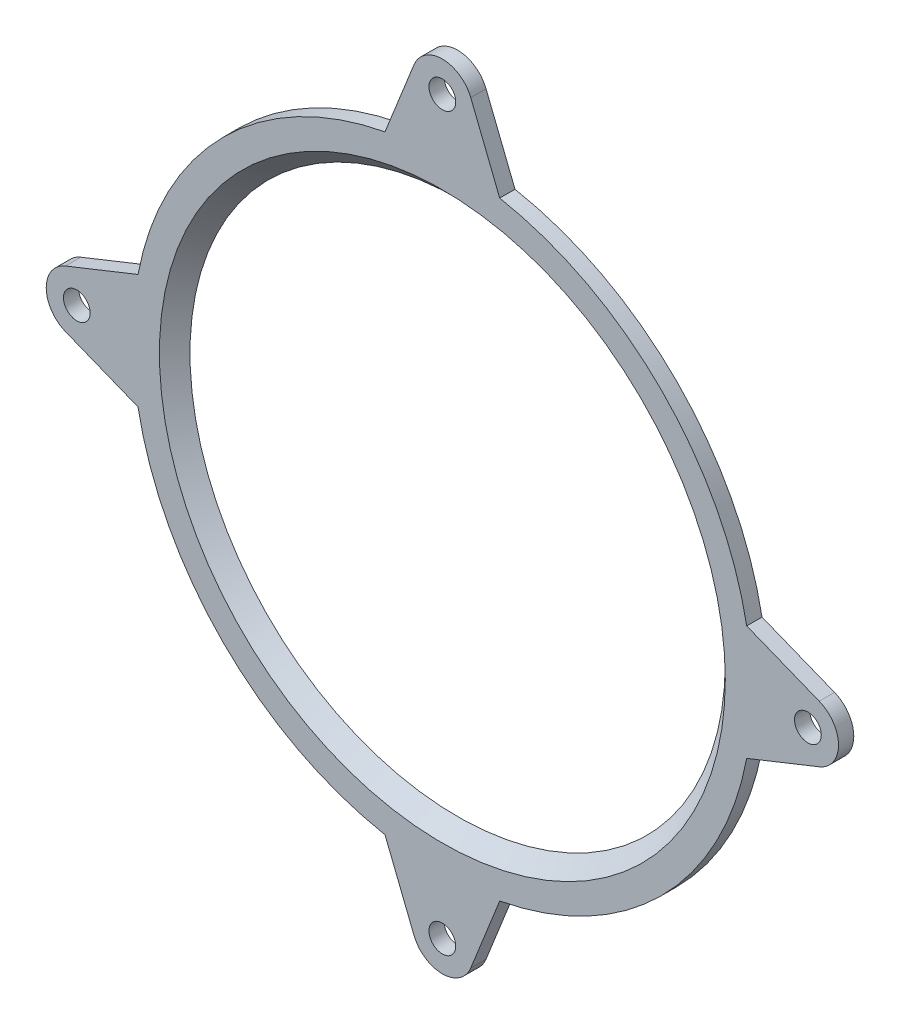
ISO-10303-21;
HEADER;
FILE_DESCRIPTION(('STEP AP214'),'2;1');
FILE_NAME('part.step','',(''),(''),'','','');
FILE_SCHEMA(('AUTOMOTIVE_DESIGN { 1 0 10303 214 1 1 1 1 }'));
ENDSEC;
DATA;
#1=APPLICATION_CONTEXT('core data for automotive mechanical design processes');
#2=APPLICATION_PROTOCOL_DEFINITION('international standard','automotive_design',2000,#1);
#3=PRODUCT_CONTEXT('',#1,'mechanical');
#4=PRODUCT('Part','Part','',(#3));
#5=PRODUCT_RELATED_PRODUCT_CATEGORY('part','',(#4));
#6=PRODUCT_DEFINITION_FORMATION('','',#4);
#7=PRODUCT_DEFINITION_CONTEXT('part definition',#1,'design');
#8=PRODUCT_DEFINITION('design','',#6,#7);
#9=PRODUCT_DEFINITION_SHAPE('','',#8);
#10=(LENGTH_UNIT() NAMED_UNIT(*) SI_UNIT(.MILLI.,.METRE.));
#11=(NAMED_UNIT(*) PLANE_ANGLE_UNIT() SI_UNIT($,.RADIAN.));
#12=(NAMED_UNIT(*) SI_UNIT($,.STERADIAN.) SOLID_ANGLE_UNIT());
#13=UNCERTAINTY_MEASURE_WITH_UNIT(LENGTH_MEASURE(1.E-05),#10,'distance_accuracy_value','');
#14=(GEOMETRIC_REPRESENTATION_CONTEXT(3) GLOBAL_UNCERTAINTY_ASSIGNED_CONTEXT((#13)) GLOBAL_UNIT_ASSIGNED_CONTEXT((#10,
#11,#12)) REPRESENTATION_CONTEXT('',''));
#15=CARTESIAN_POINT('',(0.,0.,0.));
#16=DIRECTION('',(0.,0.,1.));
#17=DIRECTION('',(1.,0.,0.));
#18=AXIS2_PLACEMENT_3D('',#15,#16,#17);
#19=CARTESIAN_POINT('',(0.,0.,2.));
#20=DIRECTION('',(0.,0.,-1.));
#21=DIRECTION('',(-1.,0.,0.));
#22=AXIS2_PLACEMENT_3D('',#19,#20,#21);
#23=CYLINDRICAL_SURFACE('',#22,40.5);
#24=DIRECTION('',(0.,0.,-1.));
#25=VECTOR('',#24,1.);
#26=CARTESIAN_POINT('',(39.7994974842649,-7.49999999999958,2.));
#27=LINE('',#26,#25);
#28=CARTESIAN_POINT('',(39.7994974842649,-7.49999999999959,2.));
#29=VERTEX_POINT('',#28);
#30=CARTESIAN_POINT('',(39.7994974842649,-7.49999999999959,0.));
#31=VERTEX_POINT('',#30);
#32=EDGE_CURVE('E63',#29,#31,#27,.T.);
#33=ORIENTED_EDGE('',*,*,#32,.F.);
#34=CARTESIAN_POINT('',(0.,0.,2.));
#35=DIRECTION('',(0.,0.,1.));
#36=DIRECTION('',(1.,0.,0.));
#37=AXIS2_PLACEMENT_3D('',#34,#35,#36);
#38=CIRCLE('',#37,40.5);
#39=CARTESIAN_POINT('',(7.50000000000001,-39.7994974842648,2.));
#40=VERTEX_POINT('',#39);
#41=EDGE_CURVE('E162',#40,#29,#38,.T.);
#42=ORIENTED_EDGE('',*,*,#41,.F.);
#43=DIRECTION('',(0.,0.,-1.));
#44=VECTOR('',#43,1.);
#45=CARTESIAN_POINT('',(7.5,-39.7994974842648,2.));
#46=LINE('',#45,#44);
#47=CARTESIAN_POINT('',(7.5,-39.7994974842648,0.));
#48=VERTEX_POINT('',#47);
#49=EDGE_CURVE('E207',#40,#48,#46,.T.);
#50=ORIENTED_EDGE('',*,*,#49,.T.);
#51=CARTESIAN_POINT('',(0.,0.,0.));
#52=DIRECTION('',(0.,0.,1.));
#53=DIRECTION('',(1.,0.,0.));
#54=AXIS2_PLACEMENT_3D('',#51,#52,#53);
#55=CIRCLE('',#54,40.5);
#56=EDGE_CURVE('E297',#48,#31,#55,.T.);
#57=ORIENTED_EDGE('',*,*,#56,.T.);
#58=EDGE_LOOP('',(#33,#42,#50,#57));
#59=FACE_BOUND('',#58,.T.);
#60=ADVANCED_FACE('F39',(#59),#23,.T.);
#61=DIRECTION('',(0.,0.,-1.));
#62=VECTOR('',#61,1.);
#63=CARTESIAN_POINT('',(39.7994974842647,7.50000000000042,2.));
#64=LINE('',#63,#62);
#65=CARTESIAN_POINT('',(39.7994974842647,7.50000000000042,2.));
#66=VERTEX_POINT('',#65);
#67=CARTESIAN_POINT('',(39.7994974842647,7.50000000000042,0.));
#68=VERTEX_POINT('',#67);
#69=EDGE_CURVE('E180',#66,#68,#64,.T.);
#70=ORIENTED_EDGE('',*,*,#69,.T.);
#71=CARTESIAN_POINT('',(7.50000000000001,39.7994974842648,0.));
#72=VERTEX_POINT('',#71);
#73=EDGE_CURVE('E290',#68,#72,#55,.T.);
#74=ORIENTED_EDGE('',*,*,#73,.T.);
#75=DIRECTION('',(0.,0.,-1.));
#76=VECTOR('',#75,1.);
#77=CARTESIAN_POINT('',(7.5,39.7994974842648,2.));
#78=LINE('',#77,#76);
#79=CARTESIAN_POINT('',(7.50000000000001,39.7994974842648,2.));
#80=VERTEX_POINT('',#79);
#81=EDGE_CURVE('E284',#80,#72,#78,.T.);
#82=ORIENTED_EDGE('',*,*,#81,.F.);
#83=EDGE_CURVE('E55',#66,#80,#38,.T.);
#84=ORIENTED_EDGE('',*,*,#83,.F.);
#85=EDGE_LOOP('',(#70,#74,#82,#84));
#86=FACE_BOUND('',#85,.T.);
#87=ADVANCED_FACE('F310',(#86),#23,.T.);
#88=DIRECTION('',(0.,0.,-1.));
#89=VECTOR('',#88,1.);
#90=CARTESIAN_POINT('',(-7.5,-39.7994974842648,2.));
#91=LINE('',#90,#89);
#92=CARTESIAN_POINT('',(-7.50000000000001,-39.7994974842648,2.));
#93=VERTEX_POINT('',#92);
#94=CARTESIAN_POINT('',(-7.50000000000001,-39.7994974842648,0.));
#95=VERTEX_POINT('',#94);
#96=EDGE_CURVE('E221',#93,#95,#91,.T.);
#97=ORIENTED_EDGE('',*,*,#96,.F.);
#98=CARTESIAN_POINT('',(-39.7994974842648,-7.50000000000013,2.));
#99=VERTEX_POINT('',#98);
#100=EDGE_CURVE('E291',#99,#93,#38,.T.);
#101=ORIENTED_EDGE('',*,*,#100,.F.);
#102=DIRECTION('',(0.,0.,-1.));
#103=VECTOR('',#102,1.);
#104=CARTESIAN_POINT('',(-39.7994974842648,-7.50000000000014,2.));
#105=LINE('',#104,#103);
#106=CARTESIAN_POINT('',(-39.7994974842648,-7.50000000000014,0.));
#107=VERTEX_POINT('',#106);
#108=EDGE_CURVE('E239',#99,#107,#105,.T.);
#109=ORIENTED_EDGE('',*,*,#108,.T.);
#110=EDGE_CURVE('E293',#107,#95,#55,.T.);
#111=ORIENTED_EDGE('',*,*,#110,.T.);
#112=EDGE_LOOP('',(#97,#101,#109,#111));
#113=FACE_BOUND('',#112,.T.);
#114=ADVANCED_FACE('F340',(#113),#23,.T.);
#115=DIRECTION('',(0.,0.,-1.));
#116=VECTOR('',#115,1.);
#117=CARTESIAN_POINT('',(-39.7994974842648,7.49999999999986,2.));
#118=LINE('',#117,#116);
#119=CARTESIAN_POINT('',(-39.7994974842648,7.49999999999986,2.));
#120=VERTEX_POINT('',#119);
#121=CARTESIAN_POINT('',(-39.7994974842648,7.49999999999986,0.));
#122=VERTEX_POINT('',#121);
#123=EDGE_CURVE('E253',#120,#122,#118,.T.);
#124=ORIENTED_EDGE('',*,*,#123,.F.);
#125=CARTESIAN_POINT('',(-7.5,39.7994974842648,2.));
#126=VERTEX_POINT('',#125);
#127=EDGE_CURVE('E48',#126,#120,#38,.T.);
#128=ORIENTED_EDGE('',*,*,#127,.F.);
#129=DIRECTION('',(0.,0.,-1.));
#130=VECTOR('',#129,1.);
#131=CARTESIAN_POINT('',(-7.5,39.7994974842648,2.));
#132=LINE('',#131,#130);
#133=CARTESIAN_POINT('',(-7.50000000000001,39.7994974842648,0.));
#134=VERTEX_POINT('',#133);
#135=EDGE_CURVE('E271',#126,#134,#132,.T.);
#136=ORIENTED_EDGE('',*,*,#135,.T.);
#137=EDGE_CURVE('E292',#134,#122,#55,.T.);
#138=ORIENTED_EDGE('',*,*,#137,.T.);
#139=EDGE_LOOP('',(#124,#128,#136,#138));
#140=FACE_BOUND('',#139,.T.);
#141=ADVANCED_FACE('F324',(#140),#23,.T.);
#142=CARTESIAN_POINT('',(0.,0.,2.));
#143=DIRECTION('',(0.,0.,1.));
#144=DIRECTION('',(1.,0.,0.));
#145=AXIS2_PLACEMENT_3D('',#142,#143,#144);
#146=PLANE('',#145);
#147=CARTESIAN_POINT('',(0.,0.,2.));
#148=DIRECTION('',(0.,0.,1.));
#149=DIRECTION('',(1.,0.,0.));
#150=AXIS2_PLACEMENT_3D('',#147,#148,#149);
#151=CIRCLE('',#150,37.);
#152=CARTESIAN_POINT('',(37.,0.,2.));
#153=VERTEX_POINT('',#152);
#154=EDGE_CURVE('E11',#153,#153,#151,.F.);
#155=ORIENTED_EDGE('',*,*,#154,.T.);
#156=EDGE_LOOP('',(#155));
#157=FACE_BOUND('',#156,.T.);
#158=ORIENTED_EDGE('',*,*,#127,.T.);
#159=DIRECTION('',(-0.928751030575038,-0.370704091164104,0.));
#160=VECTOR('',#159,1.);
#161=CARTESIAN_POINT('',(-39.7994974842648,7.49999999999986,2.));
#162=LINE('',#161,#160);
#163=CARTESIAN_POINT('',(-49.2823138489212,3.71500412229998,2.));
#164=VERTEX_POINT('',#163);
#165=EDGE_CURVE('E231',#120,#164,#162,.T.);
#166=ORIENTED_EDGE('',*,*,#165,.T.);
#167=CARTESIAN_POINT('',(-47.7994974842648,-1.6689105347239E-13,2.));
#168=DIRECTION('',(0.,0.,1.));
#169=DIRECTION('',(0.,1.,0.));
#170=AXIS2_PLACEMENT_3D('',#167,#168,#169);
#171=CIRCLE('',#170,4.);
#172=CARTESIAN_POINT('',(-49.2823138489212,-3.71500412230033,2.));
#173=VERTEX_POINT('',#172);
#174=EDGE_CURVE('E233',#164,#173,#171,.T.);
#175=ORIENTED_EDGE('',*,*,#174,.T.);
#176=DIRECTION('',(0.928751030575041,-0.370704091164097,0.));
#177=VECTOR('',#176,1.);
#178=CARTESIAN_POINT('',(-39.7994974842648,-7.50000000000014,2.));
#179=LINE('',#178,#177);
#180=EDGE_CURVE('E236',#173,#99,#179,.T.);
#181=ORIENTED_EDGE('',*,*,#180,.T.);
#182=ORIENTED_EDGE('',*,*,#100,.T.);
#183=DIRECTION('',(0.3707040911641,-0.92875103057504,0.));
#184=VECTOR('',#183,1.);
#185=CARTESIAN_POINT('',(-7.5,-39.7994974842648,2.));
#186=LINE('',#185,#184);
#187=CARTESIAN_POINT('',(-3.71500412230015,-49.2823138489212,2.));
#188=VERTEX_POINT('',#187);
#189=EDGE_CURVE('E200',#93,#188,#186,.T.);
#190=ORIENTED_EDGE('',*,*,#189,.T.);
#191=CARTESIAN_POINT('',(0.,-47.7994974842648,2.));
#192=DIRECTION('',(0.,0.,1.));
#193=DIRECTION('',(-1.,0.,0.));
#194=AXIS2_PLACEMENT_3D('',#191,#192,#193);
#195=CIRCLE('',#194,4.);
#196=CARTESIAN_POINT('',(3.71500412230015,-49.2823138489212,2.));
#197=VERTEX_POINT('',#196);
#198=EDGE_CURVE('E202',#188,#197,#195,.T.);
#199=ORIENTED_EDGE('',*,*,#198,.T.);
#200=DIRECTION('',(0.3707040911641,0.92875103057504,0.));
#201=VECTOR('',#200,1.);
#202=CARTESIAN_POINT('',(7.5,-39.7994974842648,2.));
#203=LINE('',#202,#201);
#204=EDGE_CURVE('E205',#197,#40,#203,.T.);
#205=ORIENTED_EDGE('',*,*,#204,.T.);
#206=ORIENTED_EDGE('',*,*,#41,.T.);
#207=DIRECTION('',(0.928751030575036,0.37070409116411,0.));
#208=VECTOR('',#207,1.);
#209=CARTESIAN_POINT('',(39.7994974842649,-7.49999999999958,2.));
#210=LINE('',#209,#208);
#211=CARTESIAN_POINT('',(49.2823138489212,-3.71500412229964,2.));
#212=VERTEX_POINT('',#211);
#213=EDGE_CURVE('E153',#29,#212,#210,.T.);
#214=ORIENTED_EDGE('',*,*,#213,.T.);
#215=CARTESIAN_POINT('',(47.7994974842648,5.0067316041717E-13,2.));
#216=DIRECTION('',(0.,0.,1.));
#217=DIRECTION('',(0.,-1.,0.));
#218=AXIS2_PLACEMENT_3D('',#215,#216,#217);
#219=CIRCLE('',#218,4.);
#220=CARTESIAN_POINT('',(49.2823138489212,3.71500412230067,2.));
#221=VERTEX_POINT('',#220);
#222=EDGE_CURVE('E159',#212,#221,#219,.T.);
#223=ORIENTED_EDGE('',*,*,#222,.T.);
#224=DIRECTION('',(-0.928751030575044,0.370704091164091,0.));
#225=VECTOR('',#224,1.);
#226=CARTESIAN_POINT('',(39.7994974842647,7.50000000000042,2.));
#227=LINE('',#226,#225);
#228=EDGE_CURVE('E178',#221,#66,#227,.T.);
#229=ORIENTED_EDGE('',*,*,#228,.T.);
#230=ORIENTED_EDGE('',*,*,#83,.T.);
#231=DIRECTION('',(-0.3707040911641,0.92875103057504,0.));
#232=VECTOR('',#231,1.);
#233=CARTESIAN_POINT('',(7.5,39.7994974842648,2.));
#234=LINE('',#233,#232);
#235=CARTESIAN_POINT('',(3.71500412230015,49.2823138489212,2.));
#236=VERTEX_POINT('',#235);
#237=EDGE_CURVE('E263',#80,#236,#234,.T.);
#238=ORIENTED_EDGE('',*,*,#237,.T.);
#239=CARTESIAN_POINT('',(0.,47.7994974842648,2.));
#240=DIRECTION('',(0.,0.,1.));
#241=DIRECTION('',(1.,0.,0.));
#242=AXIS2_PLACEMENT_3D('',#239,#240,#241);
#243=CIRCLE('',#242,4.);
#244=CARTESIAN_POINT('',(-3.71500412230015,49.2823138489212,2.));
#245=VERTEX_POINT('',#244);
#246=EDGE_CURVE('E265',#236,#245,#243,.T.);
#247=ORIENTED_EDGE('',*,*,#246,.T.);
#248=DIRECTION('',(-0.3707040911641,-0.92875103057504,0.));
#249=VECTOR('',#248,1.);
#250=CARTESIAN_POINT('',(-7.5,39.7994974842648,2.));
#251=LINE('',#250,#249);
#252=EDGE_CURVE('E268',#245,#126,#251,.T.);
#253=ORIENTED_EDGE('',*,*,#252,.T.);
#254=EDGE_LOOP('',(#158,#166,#175,#181,#182,#190,#199,#205,#206,#214,#223,#229,#230,#238,#247,#253));
#255=FACE_BOUND('',#254,.T.);
#256=CARTESIAN_POINT('',(0.,47.7994974842648,2.));
#257=DIRECTION('',(0.,0.,1.));
#258=DIRECTION('',(1.,0.,0.));
#259=AXIS2_PLACEMENT_3D('',#256,#257,#258);
#260=CIRCLE('',#259,1.75);
#261=CARTESIAN_POINT('',(1.75,47.7994974842648,2.));
#262=VERTEX_POINT('',#261);
#263=EDGE_CURVE('E257',#262,#262,#260,.T.);
#264=ORIENTED_EDGE('',*,*,#263,.F.);
#265=EDGE_LOOP('',(#264));
#266=FACE_BOUND('',#265,.T.);
#267=CARTESIAN_POINT('',(-47.7994974842648,-1.6689105347239E-13,2.));
#268=DIRECTION('',(0.,0.,1.));
#269=DIRECTION('',(0.,1.,0.));
#270=AXIS2_PLACEMENT_3D('',#267,#268,#269);
#271=CIRCLE('',#270,1.75);
#272=CARTESIAN_POINT('',(-47.7994974842648,1.74999999999983,2.));
#273=VERTEX_POINT('',#272);
#274=EDGE_CURVE('E225',#273,#273,#271,.T.);
#275=ORIENTED_EDGE('',*,*,#274,.F.);
#276=EDGE_LOOP('',(#275));
#277=FACE_BOUND('',#276,.T.);
#278=CARTESIAN_POINT('',(0.,-47.7994974842648,2.));
#279=DIRECTION('',(0.,0.,1.));
#280=DIRECTION('',(-1.,0.,0.));
#281=AXIS2_PLACEMENT_3D('',#278,#279,#280);
#282=CIRCLE('',#281,1.75);
#283=CARTESIAN_POINT('',(-1.75,-47.7994974842648,2.));
#284=VERTEX_POINT('',#283);
#285=EDGE_CURVE('E194',#284,#284,#282,.T.);
#286=ORIENTED_EDGE('',*,*,#285,.F.);
#287=EDGE_LOOP('',(#286));
#288=FACE_BOUND('',#287,.T.);
#289=CARTESIAN_POINT('',(47.7994974842648,5.0067316041717E-13,2.));
#290=DIRECTION('',(0.,0.,1.));
#291=DIRECTION('',(0.,-1.,0.));
#292=AXIS2_PLACEMENT_3D('',#289,#290,#291);
#293=CIRCLE('',#292,1.75);
#294=CARTESIAN_POINT('',(47.7994974842648,-1.7499999999995,2.));
#295=VERTEX_POINT('',#294);
#296=EDGE_CURVE('E186',#295,#295,#293,.T.);
#297=ORIENTED_EDGE('',*,*,#296,.F.);
#298=EDGE_LOOP('',(#297));
#299=FACE_BOUND('',#298,.T.);
#300=ADVANCED_FACE('F156',(#157,#255,#266,#277,#288,#299),#146,.T.);
#301=CARTESIAN_POINT('',(0.,0.,0.));
#302=DIRECTION('',(0.,0.,1.));
#303=DIRECTION('',(1.,0.,0.));
#304=AXIS2_PLACEMENT_3D('',#301,#302,#303);
#305=PLANE('',#304);
#306=ORIENTED_EDGE('',*,*,#137,.F.);
#307=DIRECTION('',(-0.3707040911641,-0.92875103057504,0.));
#308=VECTOR('',#307,1.);
#309=CARTESIAN_POINT('',(-7.5,39.7994974842648,0.));
#310=LINE('',#309,#308);
#311=CARTESIAN_POINT('',(-3.71500412230015,49.2823138489212,0.));
#312=VERTEX_POINT('',#311);
#313=EDGE_CURVE('E266',#312,#134,#310,.T.);
#314=ORIENTED_EDGE('',*,*,#313,.F.);
#315=CARTESIAN_POINT('',(0.,47.7994974842648,0.));
#316=DIRECTION('',(0.,0.,1.));
#317=DIRECTION('',(1.,0.,0.));
#318=AXIS2_PLACEMENT_3D('',#315,#316,#317);
#319=CIRCLE('',#318,4.);
#320=CARTESIAN_POINT('',(3.71500412230015,49.2823138489212,0.));
#321=VERTEX_POINT('',#320);
#322=EDGE_CURVE('E273',#321,#312,#319,.T.);
#323=ORIENTED_EDGE('',*,*,#322,.F.);
#324=DIRECTION('',(-0.3707040911641,0.92875103057504,0.));
#325=VECTOR('',#324,1.);
#326=CARTESIAN_POINT('',(7.5,39.7994974842648,0.));
#327=LINE('',#326,#325);
#328=EDGE_CURVE('E260',#72,#321,#327,.T.);
#329=ORIENTED_EDGE('',*,*,#328,.F.);
#330=ORIENTED_EDGE('',*,*,#73,.F.);
#331=DIRECTION('',(-0.928751030575044,0.370704091164091,0.));
#332=VECTOR('',#331,1.);
#333=CARTESIAN_POINT('',(39.7994974842647,7.50000000000042,0.));
#334=LINE('',#333,#332);
#335=CARTESIAN_POINT('',(49.2823138489212,3.71500412230067,0.));
#336=VERTEX_POINT('',#335);
#337=EDGE_CURVE('E164',#336,#68,#334,.T.);
#338=ORIENTED_EDGE('',*,*,#337,.F.);
#339=CARTESIAN_POINT('',(47.7994974842648,5.0067316041717E-13,0.));
#340=DIRECTION('',(0.,0.,1.));
#341=DIRECTION('',(0.,-1.,0.));
#342=AXIS2_PLACEMENT_3D('',#339,#340,#341);
#343=CIRCLE('',#342,4.);
#344=CARTESIAN_POINT('',(49.2823138489212,-3.71500412229964,0.));
#345=VERTEX_POINT('',#344);
#346=EDGE_CURVE('E185',#345,#336,#343,.T.);
#347=ORIENTED_EDGE('',*,*,#346,.F.);
#348=DIRECTION('',(0.928751030575036,0.37070409116411,0.));
#349=VECTOR('',#348,1.);
#350=CARTESIAN_POINT('',(39.7994974842649,-7.49999999999958,0.));
#351=LINE('',#350,#349);
#352=EDGE_CURVE('E170',#31,#345,#351,.T.);
#353=ORIENTED_EDGE('',*,*,#352,.F.);
#354=ORIENTED_EDGE('',*,*,#56,.F.);
#355=DIRECTION('',(0.3707040911641,0.92875103057504,0.));
#356=VECTOR('',#355,1.);
#357=CARTESIAN_POINT('',(7.5,-39.7994974842648,0.));
#358=LINE('',#357,#356);
#359=CARTESIAN_POINT('',(3.71500412230015,-49.2823138489212,0.));
#360=VERTEX_POINT('',#359);
#361=EDGE_CURVE('E203',#360,#48,#358,.T.);
#362=ORIENTED_EDGE('',*,*,#361,.F.);
#363=CARTESIAN_POINT('',(0.,-47.7994974842648,0.));
#364=DIRECTION('',(0.,0.,1.));
#365=DIRECTION('',(-1.,0.,0.));
#366=AXIS2_PLACEMENT_3D('',#363,#364,#365);
#367=CIRCLE('',#366,4.);
#368=CARTESIAN_POINT('',(-3.71500412230015,-49.2823138489212,0.));
#369=VERTEX_POINT('',#368);
#370=EDGE_CURVE('E209',#369,#360,#367,.T.);
#371=ORIENTED_EDGE('',*,*,#370,.F.);
#372=DIRECTION('',(0.3707040911641,-0.92875103057504,0.));
#373=VECTOR('',#372,1.);
#374=CARTESIAN_POINT('',(-7.5,-39.7994974842648,0.));
#375=LINE('',#374,#373);
#376=EDGE_CURVE('E197',#95,#369,#375,.T.);
#377=ORIENTED_EDGE('',*,*,#376,.F.);
#378=ORIENTED_EDGE('',*,*,#110,.F.);
#379=DIRECTION('',(0.928751030575041,-0.370704091164097,0.));
#380=VECTOR('',#379,1.);
#381=CARTESIAN_POINT('',(-39.7994974842648,-7.50000000000014,0.));
#382=LINE('',#381,#380);
#383=CARTESIAN_POINT('',(-49.2823138489212,-3.71500412230033,0.));
#384=VERTEX_POINT('',#383);
#385=EDGE_CURVE('E234',#384,#107,#382,.T.);
#386=ORIENTED_EDGE('',*,*,#385,.F.);
#387=CARTESIAN_POINT('',(-47.7994974842648,-1.6689105347239E-13,0.));
#388=DIRECTION('',(0.,0.,1.));
#389=DIRECTION('',(0.,1.,0.));
#390=AXIS2_PLACEMENT_3D('',#387,#388,#389);
#391=CIRCLE('',#390,4.);
#392=CARTESIAN_POINT('',(-49.2823138489212,3.71500412229998,0.));
#393=VERTEX_POINT('',#392);
#394=EDGE_CURVE('E241',#393,#384,#391,.T.);
#395=ORIENTED_EDGE('',*,*,#394,.F.);
#396=DIRECTION('',(-0.928751030575038,-0.370704091164104,0.));
#397=VECTOR('',#396,1.);
#398=CARTESIAN_POINT('',(-39.7994974842648,7.49999999999986,0.));
#399=LINE('',#398,#397);
#400=EDGE_CURVE('E228',#122,#393,#399,.T.);
#401=ORIENTED_EDGE('',*,*,#400,.F.);
#402=EDGE_LOOP('',(#306,#314,#323,#329,#330,#338,#347,#353,#354,#362,#371,#377,#378,#386,#395,#401));
#403=FACE_BOUND('',#402,.T.);
#404=CARTESIAN_POINT('',(0.,0.,0.));
#405=DIRECTION('',(0.,0.,1.));
#406=DIRECTION('',(1.,0.,0.));
#407=AXIS2_PLACEMENT_3D('',#404,#405,#406);
#408=CIRCLE('',#407,35.);
#409=CARTESIAN_POINT('',(35.,0.,0.));
#410=VERTEX_POINT('',#409);
#411=EDGE_CURVE('E287',#410,#410,#408,.T.);
#412=ORIENTED_EDGE('',*,*,#411,.T.);
#413=EDGE_LOOP('',(#412));
#414=FACE_BOUND('',#413,.T.);
#415=CARTESIAN_POINT('',(0.,47.7994974842648,0.));
#416=DIRECTION('',(0.,0.,1.));
#417=DIRECTION('',(1.,0.,0.));
#418=AXIS2_PLACEMENT_3D('',#415,#416,#417);
#419=CIRCLE('',#418,1.75);
#420=CARTESIAN_POINT('',(1.75,47.7994974842648,0.));
#421=VERTEX_POINT('',#420);
#422=EDGE_CURVE('E256',#421,#421,#419,.T.);
#423=ORIENTED_EDGE('',*,*,#422,.T.);
#424=EDGE_LOOP('',(#423));
#425=FACE_BOUND('',#424,.T.);
#426=CARTESIAN_POINT('',(-47.7994974842648,-1.6689105347239E-13,0.));
#427=DIRECTION('',(0.,0.,1.));
#428=DIRECTION('',(0.,1.,0.));
#429=AXIS2_PLACEMENT_3D('',#426,#427,#428);
#430=CIRCLE('',#429,1.75);
#431=CARTESIAN_POINT('',(-47.7994974842648,1.74999999999983,0.));
#432=VERTEX_POINT('',#431);
#433=EDGE_CURVE('E224',#432,#432,#430,.T.);
#434=ORIENTED_EDGE('',*,*,#433,.T.);
#435=EDGE_LOOP('',(#434));
#436=FACE_BOUND('',#435,.T.);
#437=CARTESIAN_POINT('',(0.,-47.7994974842648,0.));
#438=DIRECTION('',(0.,0.,1.));
#439=DIRECTION('',(-1.,0.,0.));
#440=AXIS2_PLACEMENT_3D('',#437,#438,#439);
#441=CIRCLE('',#440,1.75);
#442=CARTESIAN_POINT('',(-1.75,-47.7994974842648,0.));
#443=VERTEX_POINT('',#442);
#444=EDGE_CURVE('E193',#443,#443,#441,.T.);
#445=ORIENTED_EDGE('',*,*,#444,.T.);
#446=EDGE_LOOP('',(#445));
#447=FACE_BOUND('',#446,.T.);
#448=CARTESIAN_POINT('',(47.7994974842648,5.0067316041717E-13,0.));
#449=DIRECTION('',(0.,0.,1.));
#450=DIRECTION('',(0.,-1.,0.));
#451=AXIS2_PLACEMENT_3D('',#448,#449,#450);
#452=CIRCLE('',#451,1.75);
#453=CARTESIAN_POINT('',(47.7994974842648,-1.7499999999995,0.));
#454=VERTEX_POINT('',#453);
#455=EDGE_CURVE('E622',#454,#454,#452,.T.);
#456=ORIENTED_EDGE('',*,*,#455,.T.);
#457=EDGE_LOOP('',(#456));
#458=FACE_BOUND('',#457,.T.);
#459=ADVANCED_FACE('F302',(#403,#414,#425,#436,#447,#458),#305,.F.);
#460=CARTESIAN_POINT('',(7.5,39.7994974842648,2.));
#461=DIRECTION('',(-0.92875103057504,-0.3707040911641,0.));
#462=DIRECTION('',(0.3707040911641,-0.92875103057504,0.));
#463=AXIS2_PLACEMENT_3D('',#460,#461,#462);
#464=PLANE('',#463);
#465=ORIENTED_EDGE('',*,*,#328,.T.);
#466=DIRECTION('',(0.,0.,-1.));
#467=VECTOR('',#466,1.);
#468=CARTESIAN_POINT('',(3.71500412230015,49.2823138489212,2.));
#469=LINE('',#468,#467);
#470=EDGE_CURVE('E281',#236,#321,#469,.T.);
#471=ORIENTED_EDGE('',*,*,#470,.F.);
#472=ORIENTED_EDGE('',*,*,#237,.F.);
#473=ORIENTED_EDGE('',*,*,#81,.T.);
#474=EDGE_LOOP('',(#465,#471,#472,#473));
#475=FACE_BOUND('',#474,.T.);
#476=ADVANCED_FACE('F312',(#475),#464,.F.);
#477=CARTESIAN_POINT('',(0.,47.7994974842648,2.));
#478=DIRECTION('',(0.,0.,-1.));
#479=DIRECTION('',(-1.,0.,0.));
#480=AXIS2_PLACEMENT_3D('',#477,#478,#479);
#481=CYLINDRICAL_SURFACE('',#480,4.);
#482=ORIENTED_EDGE('',*,*,#322,.T.);
#483=DIRECTION('',(0.,0.,-1.));
#484=VECTOR('',#483,1.);
#485=CARTESIAN_POINT('',(-3.71500412230015,49.2823138489212,2.));
#486=LINE('',#485,#484);
#487=EDGE_CURVE('E278',#245,#312,#486,.T.);
#488=ORIENTED_EDGE('',*,*,#487,.F.);
#489=ORIENTED_EDGE('',*,*,#246,.F.);
#490=ORIENTED_EDGE('',*,*,#470,.T.);
#491=EDGE_LOOP('',(#482,#488,#489,#490));
#492=FACE_BOUND('',#491,.T.);
#493=ADVANCED_FACE('F317',(#492),#481,.T.);
#494=CARTESIAN_POINT('',(-7.5,39.7994974842648,2.));
#495=DIRECTION('',(0.92875103057504,-0.3707040911641,0.));
#496=DIRECTION('',(0.3707040911641,0.92875103057504,0.));
#497=AXIS2_PLACEMENT_3D('',#494,#495,#496);
#498=PLANE('',#497);
#499=ORIENTED_EDGE('',*,*,#313,.T.);
#500=ORIENTED_EDGE('',*,*,#135,.F.);
#501=ORIENTED_EDGE('',*,*,#252,.F.);
#502=ORIENTED_EDGE('',*,*,#487,.T.);
#503=EDGE_LOOP('',(#499,#500,#501,#502));
#504=FACE_BOUND('',#503,.T.);
#505=ADVANCED_FACE('F322',(#504),#498,.F.);
#506=CARTESIAN_POINT('',(0.,47.7994974842648,2.));
#507=DIRECTION('',(0.,0.,-1.));
#508=DIRECTION('',(-1.,0.,0.));
#509=AXIS2_PLACEMENT_3D('',#506,#507,#508);
#510=CYLINDRICAL_SURFACE('',#509,1.75);
#511=ORIENTED_EDGE('',*,*,#263,.T.);
#512=EDGE_LOOP('',(#511));
#513=FACE_BOUND('',#512,.T.);
#514=ORIENTED_EDGE('',*,*,#422,.F.);
#515=EDGE_LOOP('',(#514));
#516=FACE_BOUND('',#515,.T.);
#517=ADVANCED_FACE('F396',(#513,#516),#510,.F.);
#518=CARTESIAN_POINT('',(-39.7994974842648,7.49999999999986,2.));
#519=DIRECTION('',(0.370704091164104,-0.928751030575038,0.));
#520=DIRECTION('',(0.928751030575038,0.370704091164104,0.));
#521=AXIS2_PLACEMENT_3D('',#518,#519,#520);
#522=PLANE('',#521);
#523=ORIENTED_EDGE('',*,*,#400,.T.);
#524=DIRECTION('',(0.,0.,-1.));
#525=VECTOR('',#524,1.);
#526=CARTESIAN_POINT('',(-49.2823138489212,3.71500412229998,2.));
#527=LINE('',#526,#525);
#528=EDGE_CURVE('E250',#164,#393,#527,.T.);
#529=ORIENTED_EDGE('',*,*,#528,.F.);
#530=ORIENTED_EDGE('',*,*,#165,.F.);
#531=ORIENTED_EDGE('',*,*,#123,.T.);
#532=EDGE_LOOP('',(#523,#529,#530,#531));
#533=FACE_BOUND('',#532,.T.);
#534=ADVANCED_FACE('F329',(#533),#522,.F.);
#535=CARTESIAN_POINT('',(-47.7994974842648,-1.6689105347239E-13,2.));
#536=DIRECTION('',(0.,0.,-1.));
#537=DIRECTION('',(-1.,0.,0.));
#538=AXIS2_PLACEMENT_3D('',#535,#536,#537);
#539=CYLINDRICAL_SURFACE('',#538,4.);
#540=ORIENTED_EDGE('',*,*,#394,.T.);
#541=DIRECTION('',(0.,0.,-1.));
#542=VECTOR('',#541,1.);
#543=CARTESIAN_POINT('',(-49.2823138489212,-3.71500412230033,2.));
#544=LINE('',#543,#542);
#545=EDGE_CURVE('E247',#173,#384,#544,.T.);
#546=ORIENTED_EDGE('',*,*,#545,.F.);
#547=ORIENTED_EDGE('',*,*,#174,.F.);
#548=ORIENTED_EDGE('',*,*,#528,.T.);
#549=EDGE_LOOP('',(#540,#546,#547,#548));
#550=FACE_BOUND('',#549,.T.);
#551=ADVANCED_FACE('F336',(#550),#539,.T.);
#552=CARTESIAN_POINT('',(-39.7994974842648,-7.50000000000014,2.));
#553=DIRECTION('',(0.370704091164097,0.928751030575041,0.));
#554=DIRECTION('',(-0.928751030575041,0.370704091164097,0.));
#555=AXIS2_PLACEMENT_3D('',#552,#553,#554);
#556=PLANE('',#555);
#557=ORIENTED_EDGE('',*,*,#385,.T.);
#558=ORIENTED_EDGE('',*,*,#108,.F.);
#559=ORIENTED_EDGE('',*,*,#180,.F.);
#560=ORIENTED_EDGE('',*,*,#545,.T.);
#561=EDGE_LOOP('',(#557,#558,#559,#560));
#562=FACE_BOUND('',#561,.T.);
#563=ADVANCED_FACE('F338',(#562),#556,.F.);
#564=CARTESIAN_POINT('',(-47.7994974842648,-1.6689105347239E-13,2.));
#565=DIRECTION('',(0.,0.,-1.));
#566=DIRECTION('',(-1.,0.,0.));
#567=AXIS2_PLACEMENT_3D('',#564,#565,#566);
#568=CYLINDRICAL_SURFACE('',#567,1.75);
#569=ORIENTED_EDGE('',*,*,#274,.T.);
#570=EDGE_LOOP('',(#569));
#571=FACE_BOUND('',#570,.T.);
#572=ORIENTED_EDGE('',*,*,#433,.F.);
#573=EDGE_LOOP('',(#572));
#574=FACE_BOUND('',#573,.T.);
#575=ADVANCED_FACE('F508',(#571,#574),#568,.F.);
#576=CARTESIAN_POINT('',(-7.5,-39.7994974842648,2.));
#577=DIRECTION('',(0.92875103057504,0.3707040911641,0.));
#578=DIRECTION('',(-0.3707040911641,0.92875103057504,0.));
#579=AXIS2_PLACEMENT_3D('',#576,#577,#578);
#580=PLANE('',#579);
#581=ORIENTED_EDGE('',*,*,#376,.T.);
#582=DIRECTION('',(0.,0.,-1.));
#583=VECTOR('',#582,1.);
#584=CARTESIAN_POINT('',(-3.71500412230015,-49.2823138489212,2.));
#585=LINE('',#584,#583);
#586=EDGE_CURVE('E218',#188,#369,#585,.T.);
#587=ORIENTED_EDGE('',*,*,#586,.F.);
#588=ORIENTED_EDGE('',*,*,#189,.F.);
#589=ORIENTED_EDGE('',*,*,#96,.T.);
#590=EDGE_LOOP('',(#581,#587,#588,#589));
#591=FACE_BOUND('',#590,.T.);
#592=ADVANCED_FACE('F345',(#591),#580,.F.);
#593=CARTESIAN_POINT('',(0.,-47.7994974842648,2.));
#594=DIRECTION('',(0.,0.,-1.));
#595=DIRECTION('',(-1.,0.,0.));
#596=AXIS2_PLACEMENT_3D('',#593,#594,#595);
#597=CYLINDRICAL_SURFACE('',#596,4.);
#598=ORIENTED_EDGE('',*,*,#370,.T.);
#599=DIRECTION('',(0.,0.,-1.));
#600=VECTOR('',#599,1.);
#601=CARTESIAN_POINT('',(3.71500412230015,-49.2823138489212,2.));
#602=LINE('',#601,#600);
#603=EDGE_CURVE('E215',#197,#360,#602,.T.);
#604=ORIENTED_EDGE('',*,*,#603,.F.);
#605=ORIENTED_EDGE('',*,*,#198,.F.);
#606=ORIENTED_EDGE('',*,*,#586,.T.);
#607=EDGE_LOOP('',(#598,#604,#605,#606));
#608=FACE_BOUND('',#607,.T.);
#609=ADVANCED_FACE('F350',(#608),#597,.T.);
#610=CARTESIAN_POINT('',(7.5,-39.7994974842648,2.));
#611=DIRECTION('',(-0.92875103057504,0.3707040911641,0.));
#612=DIRECTION('',(-0.3707040911641,-0.92875103057504,0.));
#613=AXIS2_PLACEMENT_3D('',#610,#611,#612);
#614=PLANE('',#613);
#615=ORIENTED_EDGE('',*,*,#361,.T.);
#616=ORIENTED_EDGE('',*,*,#49,.F.);
#617=ORIENTED_EDGE('',*,*,#204,.F.);
#618=ORIENTED_EDGE('',*,*,#603,.T.);
#619=EDGE_LOOP('',(#615,#616,#617,#618));
#620=FACE_BOUND('',#619,.T.);
#621=ADVANCED_FACE('F353',(#620),#614,.F.);
#622=CARTESIAN_POINT('',(0.,-47.7994974842648,2.));
#623=DIRECTION('',(0.,0.,-1.));
#624=DIRECTION('',(-1.,0.,0.));
#625=AXIS2_PLACEMENT_3D('',#622,#623,#624);
#626=CYLINDRICAL_SURFACE('',#625,1.75);
#627=ORIENTED_EDGE('',*,*,#285,.T.);
#628=EDGE_LOOP('',(#627));
#629=FACE_BOUND('',#628,.T.);
#630=ORIENTED_EDGE('',*,*,#444,.F.);
#631=EDGE_LOOP('',(#630));
#632=FACE_BOUND('',#631,.T.);
#633=ADVANCED_FACE('F355',(#629,#632),#626,.F.);
#634=CARTESIAN_POINT('',(39.7994974842649,-7.49999999999958,2.));
#635=DIRECTION('',(-0.37070409116411,0.928751030575036,0.));
#636=DIRECTION('',(-0.928751030575036,-0.37070409116411,0.));
#637=AXIS2_PLACEMENT_3D('',#634,#635,#636);
#638=PLANE('',#637);
#639=ORIENTED_EDGE('',*,*,#352,.T.);
#640=DIRECTION('',(0.,0.,-1.));
#641=VECTOR('',#640,1.);
#642=CARTESIAN_POINT('',(49.2823138489212,-3.71500412229964,2.));
#643=LINE('',#642,#641);
#644=EDGE_CURVE('E167',#212,#345,#643,.T.);
#645=ORIENTED_EDGE('',*,*,#644,.F.);
#646=ORIENTED_EDGE('',*,*,#213,.F.);
#647=ORIENTED_EDGE('',*,*,#32,.T.);
#648=EDGE_LOOP('',(#639,#645,#646,#647));
#649=FACE_BOUND('',#648,.T.);
#650=ADVANCED_FACE('F168',(#649),#638,.F.);
#651=CARTESIAN_POINT('',(47.7994974842648,5.0067316041717E-13,2.));
#652=DIRECTION('',(0.,0.,-1.));
#653=DIRECTION('',(-1.,0.,0.));
#654=AXIS2_PLACEMENT_3D('',#651,#652,#653);
#655=CYLINDRICAL_SURFACE('',#654,4.);
#656=ORIENTED_EDGE('',*,*,#346,.T.);
#657=DIRECTION('',(0.,0.,-1.));
#658=VECTOR('',#657,1.);
#659=CARTESIAN_POINT('',(49.2823138489212,3.71500412230067,2.));
#660=LINE('',#659,#658);
#661=EDGE_CURVE('E173',#221,#336,#660,.T.);
#662=ORIENTED_EDGE('',*,*,#661,.F.);
#663=ORIENTED_EDGE('',*,*,#222,.F.);
#664=ORIENTED_EDGE('',*,*,#644,.T.);
#665=EDGE_LOOP('',(#656,#662,#663,#664));
#666=FACE_BOUND('',#665,.T.);
#667=ADVANCED_FACE('F175',(#666),#655,.T.);
#668=CARTESIAN_POINT('',(39.7994974842647,7.50000000000042,2.));
#669=DIRECTION('',(-0.370704091164091,-0.928751030575044,0.));
#670=DIRECTION('',(0.928751030575044,-0.370704091164091,0.));
#671=AXIS2_PLACEMENT_3D('',#668,#669,#670);
#672=PLANE('',#671);
#673=ORIENTED_EDGE('',*,*,#337,.T.);
#674=ORIENTED_EDGE('',*,*,#69,.F.);
#675=ORIENTED_EDGE('',*,*,#228,.F.);
#676=ORIENTED_EDGE('',*,*,#661,.T.);
#677=EDGE_LOOP('',(#673,#674,#675,#676));
#678=FACE_BOUND('',#677,.T.);
#679=ADVANCED_FACE('F306',(#678),#672,.F.);
#680=CARTESIAN_POINT('',(47.7994974842648,5.0067316041717E-13,2.));
#681=DIRECTION('',(0.,0.,-1.));
#682=DIRECTION('',(-1.,0.,0.));
#683=AXIS2_PLACEMENT_3D('',#680,#681,#682);
#684=CYLINDRICAL_SURFACE('',#683,1.75);
#685=ORIENTED_EDGE('',*,*,#296,.T.);
#686=EDGE_LOOP('',(#685));
#687=FACE_BOUND('',#686,.T.);
#688=ORIENTED_EDGE('',*,*,#455,.F.);
#689=EDGE_LOOP('',(#688));
#690=FACE_BOUND('',#689,.T.);
#691=ADVANCED_FACE('F451',(#687,#690),#684,.F.);
#692=CARTESIAN_POINT('',(0.,0.,0.));
#693=DIRECTION('',(0.,0.,1.));
#694=DIRECTION('',(1.,0.,0.));
#695=AXIS2_PLACEMENT_3D('',#692,#693,#694);
#696=CONICAL_SURFACE('',#695,35.,0.785398163397453);
#697=ORIENTED_EDGE('',*,*,#154,.F.);
#698=EDGE_LOOP('',(#697));
#699=FACE_BOUND('',#698,.T.);
#700=ORIENTED_EDGE('',*,*,#411,.F.);
#701=EDGE_LOOP('',(#700));
#702=FACE_BOUND('',#701,.T.);
#703=ADVANCED_FACE('F42',(#699,#702),#696,.F.);
#704=CLOSED_SHELL('',(#60,#87,#114,#141,#300,#459,#476,#493,#505,#517,#534,#551,#563,#575,#592,
#609,#621,#633,#650,#667,#679,#691,#703));
#705=MANIFOLD_SOLID_BREP('B2',#704);
#706=ADVANCED_BREP_SHAPE_REPRESENTATION('',(#18,#705),#14);
#707=SHAPE_DEFINITION_REPRESENTATION(#9,#706);
ENDSEC;
END-ISO-10303-21;
